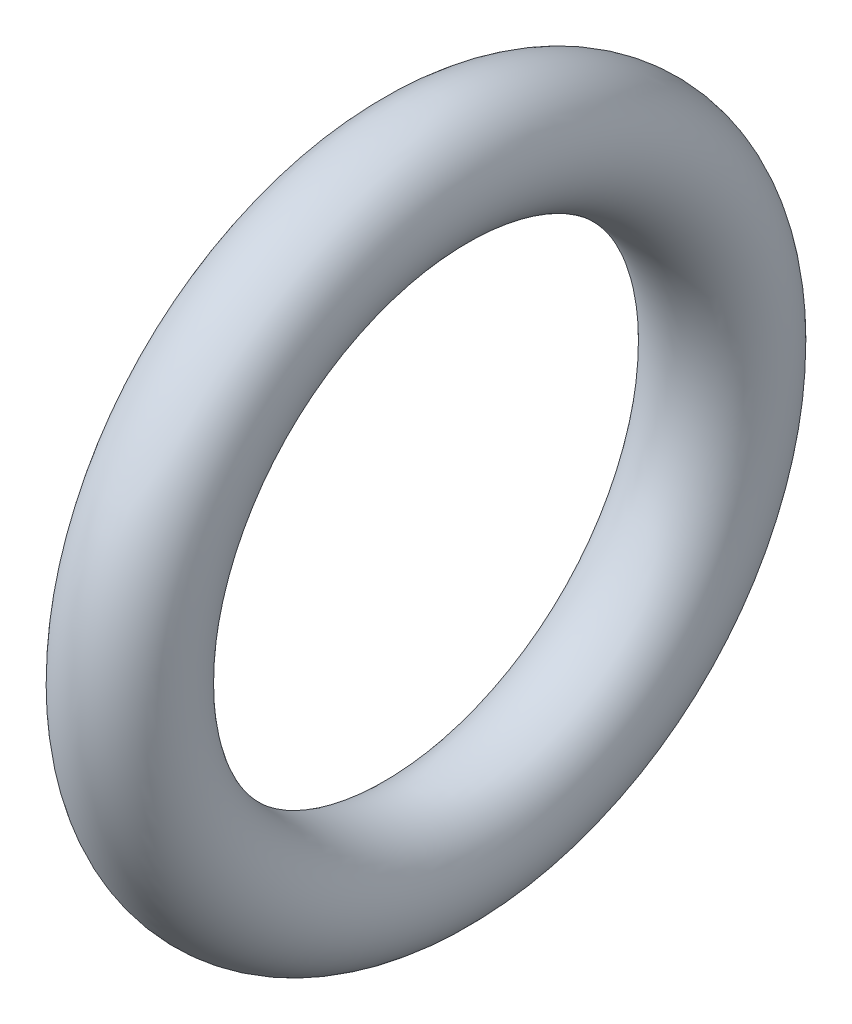
ISO-10303-21;
HEADER;
FILE_DESCRIPTION(('STEP AP214'),'2;1');
FILE_NAME('part.step','',(''),(''),'','','');
FILE_SCHEMA(('AUTOMOTIVE_DESIGN { 1 0 10303 214 1 1 1 1 }'));
ENDSEC;
DATA;
#1=APPLICATION_CONTEXT('core data for automotive mechanical design processes');
#2=APPLICATION_PROTOCOL_DEFINITION('international standard','automotive_design',2000,#1);
#3=PRODUCT_CONTEXT('',#1,'mechanical');
#4=PRODUCT('Part','Part','',(#3));
#5=PRODUCT_RELATED_PRODUCT_CATEGORY('part','',(#4));
#6=PRODUCT_DEFINITION_FORMATION('','',#4);
#7=PRODUCT_DEFINITION_CONTEXT('part definition',#1,'design');
#8=PRODUCT_DEFINITION('design','',#6,#7);
#9=PRODUCT_DEFINITION_SHAPE('','',#8);
#10=(LENGTH_UNIT() NAMED_UNIT(*) SI_UNIT(.MILLI.,.METRE.));
#11=(NAMED_UNIT(*) PLANE_ANGLE_UNIT() SI_UNIT($,.RADIAN.));
#12=(NAMED_UNIT(*) SI_UNIT($,.STERADIAN.) SOLID_ANGLE_UNIT());
#13=UNCERTAINTY_MEASURE_WITH_UNIT(LENGTH_MEASURE(1.E-05),#10,'distance_accuracy_value','');
#14=(GEOMETRIC_REPRESENTATION_CONTEXT(3) GLOBAL_UNCERTAINTY_ASSIGNED_CONTEXT((#13)) GLOBAL_UNIT_ASSIGNED_CONTEXT((#10,
#11,#12)) REPRESENTATION_CONTEXT('',''));
#15=CARTESIAN_POINT('',(0.,0.,0.));
#16=DIRECTION('',(0.,0.,1.));
#17=DIRECTION('',(1.,0.,0.));
#18=AXIS2_PLACEMENT_3D('',#15,#16,#17);
#19=CARTESIAN_POINT('',(0.,0.,0.));
#20=DIRECTION('',(-1.,0.,0.));
#21=DIRECTION('',(0.,0.,1.));
#22=AXIS2_PLACEMENT_3D('',#19,#20,#21);
#23=TOROIDAL_SURFACE('',#22,6.25,1.25);
#24=CARTESIAN_POINT('',(0.,0.,7.5));
#25=VERTEX_POINT('',#24);
#26=VERTEX_LOOP('',#25);
#27=FACE_BOUND('',#26,.T.);
#28=ADVANCED_FACE('F346',(#27),#23,.T.);
#29=CLOSED_SHELL('',(#28));
#30=MANIFOLD_SOLID_BREP('B2',#29);
#31=ADVANCED_BREP_SHAPE_REPRESENTATION('',(#18,#30),#14);
#32=SHAPE_DEFINITION_REPRESENTATION(#9,#31);
ENDSEC;
END-ISO-10303-21;
